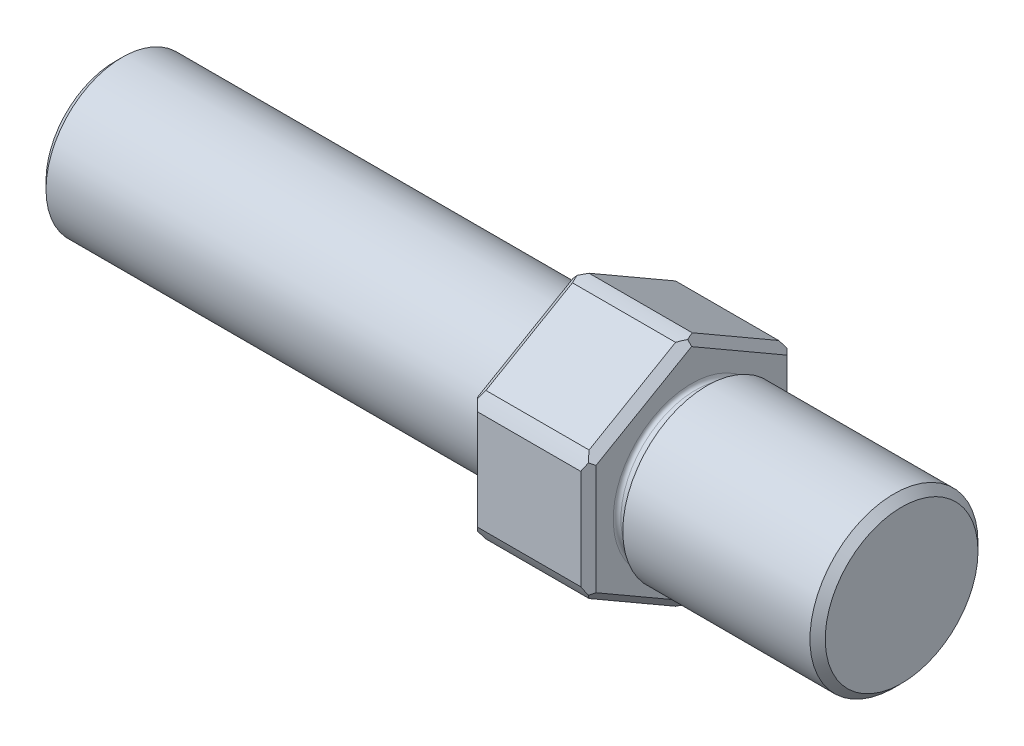
ISO-10303-21;
HEADER;
FILE_DESCRIPTION(('STEP AP214'),'2;1');
FILE_NAME('part.step','',(''),(''),'','','');
FILE_SCHEMA(('AUTOMOTIVE_DESIGN { 1 0 10303 214 1 1 1 1 }'));
ENDSEC;
DATA;
#1=APPLICATION_CONTEXT('core data for automotive mechanical design processes');
#2=APPLICATION_PROTOCOL_DEFINITION('international standard','automotive_design',2000,#1);
#3=PRODUCT_CONTEXT('',#1,'mechanical');
#4=PRODUCT('Part','Part','',(#3));
#5=PRODUCT_RELATED_PRODUCT_CATEGORY('part','',(#4));
#6=PRODUCT_DEFINITION_FORMATION('','',#4);
#7=PRODUCT_DEFINITION_CONTEXT('part definition',#1,'design');
#8=PRODUCT_DEFINITION('design','',#6,#7);
#9=PRODUCT_DEFINITION_SHAPE('','',#8);
#10=(LENGTH_UNIT() NAMED_UNIT(*) SI_UNIT(.MILLI.,.METRE.));
#11=(NAMED_UNIT(*) PLANE_ANGLE_UNIT() SI_UNIT($,.RADIAN.));
#12=(NAMED_UNIT(*) SI_UNIT($,.STERADIAN.) SOLID_ANGLE_UNIT());
#13=UNCERTAINTY_MEASURE_WITH_UNIT(LENGTH_MEASURE(1.E-05),#10,'distance_accuracy_value','');
#14=(GEOMETRIC_REPRESENTATION_CONTEXT(3) GLOBAL_UNCERTAINTY_ASSIGNED_CONTEXT((#13)) GLOBAL_UNIT_ASSIGNED_CONTEXT((#10,
#11,#12)) REPRESENTATION_CONTEXT('',''));
#15=CARTESIAN_POINT('',(0.,0.,0.));
#16=DIRECTION('',(0.,0.,1.));
#17=DIRECTION('',(1.,0.,0.));
#18=AXIS2_PLACEMENT_3D('',#15,#16,#17);
#19=CARTESIAN_POINT('',(-38.5,15.5884572681199,0.));
#20=DIRECTION('',(0.,-0.866025403784439,-0.5));
#21=DIRECTION('',(0.,0.5,-0.866025403784439));
#22=AXIS2_PLACEMENT_3D('',#19,#20,#21);
#23=PLANE('',#22);
#24=DIRECTION('',(-1.,0.,0.));
#25=VECTOR('',#24,1.);
#26=CARTESIAN_POINT('',(17.2226126327971,8.42216874343441,12.4123758264531));
#27=LINE('',#26,#25);
#28=CARTESIAN_POINT('',(-39.5,8.42216874343441,12.4123758264531));
#29=VERTEX_POINT('',#28);
#30=CARTESIAN_POINT('',(-53.,8.4221687434344,12.4123758264531));
#31=VERTEX_POINT('',#30);
#32=EDGE_CURVE('E319',#29,#31,#27,.T.);
#33=ORIENTED_EDGE('',*,*,#32,.F.);
#34=DIRECTION('',(0.,0.5,-0.866025403784439));
#35=VECTOR('',#34,1.);
#36=CARTESIAN_POINT('',(-39.5,15.5884572681199,0.));
#37=LINE('',#36,#35);
#38=CARTESIAN_POINT('',(-39.5,14.9605171587454,1.08762417354695));
#39=VERTEX_POINT('',#38);
#40=EDGE_CURVE('E211',#29,#39,#37,.T.);
#41=ORIENTED_EDGE('',*,*,#40,.T.);
#42=DIRECTION('',(-1.,0.,0.));
#43=VECTOR('',#42,1.);
#44=CARTESIAN_POINT('',(17.2226126327971,14.9605171587454,1.08762417354695));
#45=LINE('',#44,#43);
#46=CARTESIAN_POINT('',(-53.,14.9605171587454,1.08762417354694));
#47=VERTEX_POINT('',#46);
#48=EDGE_CURVE('E197',#47,#39,#45,.F.);
#49=ORIENTED_EDGE('',*,*,#48,.F.);
#50=DIRECTION('',(0.,-0.5,0.866025403784439));
#51=VECTOR('',#50,1.);
#52=CARTESIAN_POINT('',(-53.,15.5884572681199,0.));
#53=LINE('',#52,#51);
#54=EDGE_CURVE('E209',#47,#31,#53,.T.);
#55=ORIENTED_EDGE('',*,*,#54,.T.);
#56=EDGE_LOOP('',(#33,#41,#49,#55));
#57=FACE_BOUND('',#56,.T.);
#58=ADVANCED_FACE('F35',(#57),#23,.F.);
#59=CARTESIAN_POINT('',(-38.5,7.79422863405995,13.5));
#60=DIRECTION('',(0.,0.,-1.));
#61=DIRECTION('',(0.,1.,0.));
#62=AXIS2_PLACEMENT_3D('',#59,#60,#61);
#63=PLANE('',#62);
#64=DIRECTION('',(-1.,0.,0.));
#65=VECTOR('',#64,1.);
#66=CARTESIAN_POINT('',(17.2226126327971,-6.53834841531103,13.5));
#67=LINE('',#66,#65);
#68=CARTESIAN_POINT('',(-39.5,-6.53834841531103,13.5));
#69=VERTEX_POINT('',#68);
#70=CARTESIAN_POINT('',(-53.,-6.53834841531103,13.5));
#71=VERTEX_POINT('',#70);
#72=EDGE_CURVE('E368',#69,#71,#67,.T.);
#73=ORIENTED_EDGE('',*,*,#72,.F.);
#74=DIRECTION('',(0.,1.,0.));
#75=VECTOR('',#74,1.);
#76=CARTESIAN_POINT('',(-39.5,7.79422863405995,13.5));
#77=LINE('',#76,#75);
#78=CARTESIAN_POINT('',(-39.5,6.53834841531103,13.5));
#79=VERTEX_POINT('',#78);
#80=EDGE_CURVE('E430',#69,#79,#77,.T.);
#81=ORIENTED_EDGE('',*,*,#80,.T.);
#82=DIRECTION('',(-1.,0.,0.));
#83=VECTOR('',#82,1.);
#84=CARTESIAN_POINT('',(17.2226126327971,6.53834841531103,13.5));
#85=LINE('',#84,#83);
#86=CARTESIAN_POINT('',(-53.,6.53834841531104,13.5));
#87=VERTEX_POINT('',#86);
#88=EDGE_CURVE('E315',#87,#79,#85,.F.);
#89=ORIENTED_EDGE('',*,*,#88,.F.);
#90=DIRECTION('',(0.,-1.,0.));
#91=VECTOR('',#90,1.);
#92=CARTESIAN_POINT('',(-53.,7.79422863405995,13.5));
#93=LINE('',#92,#91);
#94=EDGE_CURVE('E312',#87,#71,#93,.T.);
#95=ORIENTED_EDGE('',*,*,#94,.T.);
#96=EDGE_LOOP('',(#73,#81,#89,#95));
#97=FACE_BOUND('',#96,.T.);
#98=ADVANCED_FACE('F454',(#97),#63,.F.);
#99=CARTESIAN_POINT('',(-38.5,-7.79422863405995,13.5));
#100=DIRECTION('',(0.,0.866025403784439,-0.5));
#101=DIRECTION('',(0.,0.5,0.866025403784439));
#102=AXIS2_PLACEMENT_3D('',#99,#100,#101);
#103=PLANE('',#102);
#104=DIRECTION('',(-1.,0.,0.));
#105=VECTOR('',#104,1.);
#106=CARTESIAN_POINT('',(17.2226126327971,-14.9605171587454,1.08762417354695));
#107=LINE('',#106,#105);
#108=CARTESIAN_POINT('',(-39.5,-14.9605171587454,1.08762417354695));
#109=VERTEX_POINT('',#108);
#110=CARTESIAN_POINT('',(-53.,-14.9605171587454,1.08762417354694));
#111=VERTEX_POINT('',#110);
#112=EDGE_CURVE('E58',#109,#111,#107,.T.);
#113=ORIENTED_EDGE('',*,*,#112,.F.);
#114=DIRECTION('',(0.,0.5,0.866025403784439));
#115=VECTOR('',#114,1.);
#116=CARTESIAN_POINT('',(-39.5,-7.79422863405995,13.5));
#117=LINE('',#116,#115);
#118=CARTESIAN_POINT('',(-39.5,-8.42216874343441,12.4123758264531));
#119=VERTEX_POINT('',#118);
#120=EDGE_CURVE('E436',#109,#119,#117,.T.);
#121=ORIENTED_EDGE('',*,*,#120,.T.);
#122=DIRECTION('',(-1.,0.,0.));
#123=VECTOR('',#122,1.);
#124=CARTESIAN_POINT('',(17.2226126327971,-8.42216874343441,12.4123758264531));
#125=LINE('',#124,#123);
#126=CARTESIAN_POINT('',(-53.,-8.4221687434344,12.4123758264531));
#127=VERTEX_POINT('',#126);
#128=EDGE_CURVE('E326',#127,#119,#125,.F.);
#129=ORIENTED_EDGE('',*,*,#128,.F.);
#130=DIRECTION('',(0.,-0.5,-0.866025403784439));
#131=VECTOR('',#130,1.);
#132=CARTESIAN_POINT('',(-53.,-7.79422863405995,13.5));
#133=LINE('',#132,#131);
#134=EDGE_CURVE('E433',#127,#111,#133,.T.);
#135=ORIENTED_EDGE('',*,*,#134,.T.);
#136=EDGE_LOOP('',(#113,#121,#129,#135));
#137=FACE_BOUND('',#136,.T.);
#138=ADVANCED_FACE('F474',(#137),#103,.F.);
#139=CARTESIAN_POINT('',(-38.5,-15.5884572681199,0.));
#140=DIRECTION('',(0.,0.866025403784439,0.5));
#141=DIRECTION('',(0.,-0.5,0.866025403784439));
#142=AXIS2_PLACEMENT_3D('',#139,#140,#141);
#143=PLANE('',#142);
#144=DIRECTION('',(-1.,0.,0.));
#145=VECTOR('',#144,1.);
#146=CARTESIAN_POINT('',(17.2226126327971,-8.42216874343444,-12.412375826453));
#147=LINE('',#146,#145);
#148=CARTESIAN_POINT('',(-39.5,-8.42216874343444,-12.412375826453));
#149=VERTEX_POINT('',#148);
#150=CARTESIAN_POINT('',(-53.,-8.42216874343443,-12.412375826453));
#151=VERTEX_POINT('',#150);
#152=EDGE_CURVE('E383',#149,#151,#147,.T.);
#153=ORIENTED_EDGE('',*,*,#152,.F.);
#154=DIRECTION('',(0.,-0.5,0.866025403784439));
#155=VECTOR('',#154,1.);
#156=CARTESIAN_POINT('',(-39.5,-15.5884572681199,0.));
#157=LINE('',#156,#155);
#158=CARTESIAN_POINT('',(-39.5,-14.9605171587454,-1.08762417354695));
#159=VERTEX_POINT('',#158);
#160=EDGE_CURVE('E217',#149,#159,#157,.T.);
#161=ORIENTED_EDGE('',*,*,#160,.T.);
#162=DIRECTION('',(-1.,0.,0.));
#163=VECTOR('',#162,1.);
#164=CARTESIAN_POINT('',(17.2226126327971,-14.9605171587454,-1.08762417354695));
#165=LINE('',#164,#163);
#166=CARTESIAN_POINT('',(-53.,-14.9605171587454,-1.08762417354695));
#167=VERTEX_POINT('',#166);
#168=EDGE_CURVE('E376',#167,#159,#165,.F.);
#169=ORIENTED_EDGE('',*,*,#168,.F.);
#170=DIRECTION('',(0.,0.5,-0.866025403784439));
#171=VECTOR('',#170,1.);
#172=CARTESIAN_POINT('',(-53.,-15.5884572681199,0.));
#173=LINE('',#172,#171);
#174=EDGE_CURVE('E222',#167,#151,#173,.T.);
#175=ORIENTED_EDGE('',*,*,#174,.T.);
#176=EDGE_LOOP('',(#153,#161,#169,#175));
#177=FACE_BOUND('',#176,.T.);
#178=ADVANCED_FACE('F441',(#177),#143,.F.);
#179=CARTESIAN_POINT('',(-38.5,-7.79422863405995,-13.5));
#180=DIRECTION('',(0.,0.,1.));
#181=DIRECTION('',(1.,0.,0.));
#182=AXIS2_PLACEMENT_3D('',#179,#180,#181);
#183=PLANE('',#182);
#184=DIRECTION('',(-1.,0.,0.));
#185=VECTOR('',#184,1.);
#186=CARTESIAN_POINT('',(17.2226126327971,6.53834841531098,-13.5));
#187=LINE('',#186,#185);
#188=CARTESIAN_POINT('',(-39.5,6.53834841531098,-13.5));
#189=VERTEX_POINT('',#188);
#190=CARTESIAN_POINT('',(-53.,6.53834841531096,-13.5));
#191=VERTEX_POINT('',#190);
#192=EDGE_CURVE('E753',#189,#191,#187,.T.);
#193=ORIENTED_EDGE('',*,*,#192,.F.);
#194=DIRECTION('',(0.,-1.,0.));
#195=VECTOR('',#194,1.);
#196=CARTESIAN_POINT('',(-39.5,-7.79422863405995,-13.5));
#197=LINE('',#196,#195);
#198=CARTESIAN_POINT('',(-39.5,-6.53834841531098,-13.5));
#199=VERTEX_POINT('',#198);
#200=EDGE_CURVE('E234',#189,#199,#197,.T.);
#201=ORIENTED_EDGE('',*,*,#200,.T.);
#202=DIRECTION('',(-1.,0.,0.));
#203=VECTOR('',#202,1.);
#204=CARTESIAN_POINT('',(17.2226126327971,-6.53834841531098,-13.5));
#205=LINE('',#204,#203);
#206=CARTESIAN_POINT('',(-53.,-6.53834841531096,-13.5));
#207=VERTEX_POINT('',#206);
#208=EDGE_CURVE('E381',#207,#199,#205,.F.);
#209=ORIENTED_EDGE('',*,*,#208,.F.);
#210=DIRECTION('',(0.,1.,0.));
#211=VECTOR('',#210,1.);
#212=CARTESIAN_POINT('',(-53.,-7.79422863405995,-13.5));
#213=LINE('',#212,#211);
#214=EDGE_CURVE('E231',#207,#191,#213,.T.);
#215=ORIENTED_EDGE('',*,*,#214,.T.);
#216=EDGE_LOOP('',(#193,#201,#209,#215));
#217=FACE_BOUND('',#216,.T.);
#218=ADVANCED_FACE('F570',(#217),#183,.F.);
#219=CARTESIAN_POINT('',(-38.5,7.79422863405995,-13.5));
#220=DIRECTION('',(0.,-0.866025403784439,0.5));
#221=DIRECTION('',(0.,-0.5,-0.866025403784439));
#222=AXIS2_PLACEMENT_3D('',#219,#220,#221);
#223=PLANE('',#222);
#224=DIRECTION('',(-1.,0.,0.));
#225=VECTOR('',#224,1.);
#226=CARTESIAN_POINT('',(17.2226126327971,14.9605171587454,-1.08762417354696));
#227=LINE('',#226,#225);
#228=CARTESIAN_POINT('',(-39.5,14.9605171587454,-1.08762417354696));
#229=VERTEX_POINT('',#228);
#230=CARTESIAN_POINT('',(-53.,14.9605171587454,-1.08762417354696));
#231=VERTEX_POINT('',#230);
#232=EDGE_CURVE('E213',#229,#231,#227,.T.);
#233=ORIENTED_EDGE('',*,*,#232,.F.);
#234=DIRECTION('',(0.,-0.5,-0.866025403784439));
#235=VECTOR('',#234,1.);
#236=CARTESIAN_POINT('',(-39.5,7.79422863405995,-13.5));
#237=LINE('',#236,#235);
#238=CARTESIAN_POINT('',(-39.5,8.42216874343444,-12.412375826453));
#239=VERTEX_POINT('',#238);
#240=EDGE_CURVE('E228',#229,#239,#237,.T.);
#241=ORIENTED_EDGE('',*,*,#240,.T.);
#242=DIRECTION('',(-1.,0.,0.));
#243=VECTOR('',#242,1.);
#244=CARTESIAN_POINT('',(17.2226126327971,8.42216874343444,-12.412375826453));
#245=LINE('',#244,#243);
#246=CARTESIAN_POINT('',(-53.,8.42216874343445,-12.412375826453));
#247=VERTEX_POINT('',#246);
#248=EDGE_CURVE('E349',#247,#239,#245,.F.);
#249=ORIENTED_EDGE('',*,*,#248,.F.);
#250=DIRECTION('',(0.,0.5,0.866025403784439));
#251=VECTOR('',#250,1.);
#252=CARTESIAN_POINT('',(-53.,7.79422863405995,-13.5));
#253=LINE('',#252,#251);
#254=EDGE_CURVE('E219',#247,#231,#253,.T.);
#255=ORIENTED_EDGE('',*,*,#254,.T.);
#256=EDGE_LOOP('',(#233,#241,#249,#255));
#257=FACE_BOUND('',#256,.T.);
#258=ADVANCED_FACE('F348',(#257),#223,.F.);
#259=CARTESIAN_POINT('',(-38.5,0.,-12.5));
#260=DIRECTION('',(0.707106781186547,0.,-0.707106781186547));
#261=DIRECTION('',(0.,-1.,0.));
#262=AXIS2_PLACEMENT_3D('',#259,#260,#261);
#263=PLANE('',#262);
#264=ORIENTED_EDGE('',*,*,#200,.F.);
#265=CARTESIAN_POINT('',(-26.,0.,0.));
#266=DIRECTION('',(0.707106781186547,0.,-0.707106781186547));
#267=DIRECTION('',(-0.707106781186548,0.,-0.707106781186548));
#268=AXIS2_PLACEMENT_3D('',#265,#266,#267);
#269=ELLIPSE('',#268,21.2132034355964,15.);
#270=CARTESIAN_POINT('',(-38.9903810567666,7.5,-12.9903810567666));
#271=VERTEX_POINT('',#270);
#272=EDGE_CURVE('E444',#189,#271,#269,.T.);
#273=ORIENTED_EDGE('',*,*,#272,.T.);
#274=DIRECTION('',(0.654653670707977,-0.377964473009228,0.654653670707977));
#275=VECTOR('',#274,1.);
#276=CARTESIAN_POINT('',(-36.7142857142857,6.18589574131743,-10.7142857142857));
#277=LINE('',#276,#275);
#278=CARTESIAN_POINT('',(-38.5,7.21687836487033,-12.5));
#279=VERTEX_POINT('',#278);
#280=EDGE_CURVE('E264',#279,#271,#277,.F.);
#281=ORIENTED_EDGE('',*,*,#280,.F.);
#282=DIRECTION('',(0.,1.,0.));
#283=VECTOR('',#282,1.);
#284=CARTESIAN_POINT('',(-38.5,7.79422863405995,-12.5));
#285=LINE('',#284,#283);
#286=CARTESIAN_POINT('',(-38.5,-7.21687836487033,-12.5));
#287=VERTEX_POINT('',#286);
#288=EDGE_CURVE('E414',#287,#279,#285,.T.);
#289=ORIENTED_EDGE('',*,*,#288,.F.);
#290=DIRECTION('',(-0.654653670707978,-0.377964473009226,-0.654653670707978));
#291=VECTOR('',#290,1.);
#292=CARTESIAN_POINT('',(-36.7142857142857,-6.18589574131743,-10.7142857142857));
#293=LINE('',#292,#291);
#294=CARTESIAN_POINT('',(-38.9903810567666,-7.49999999999999,-12.9903810567666));
#295=VERTEX_POINT('',#294);
#296=EDGE_CURVE('E262',#295,#287,#293,.F.);
#297=ORIENTED_EDGE('',*,*,#296,.F.);
#298=EDGE_CURVE('E271',#295,#199,#269,.T.);
#299=ORIENTED_EDGE('',*,*,#298,.T.);
#300=EDGE_LOOP('',(#264,#273,#281,#289,#297,#299));
#301=FACE_BOUND('',#300,.T.);
#302=ADVANCED_FACE('F521',(#301),#263,.T.);
#303=CARTESIAN_POINT('',(-38.5,10.8253175473055,-6.25000000000001));
#304=DIRECTION('',(0.707106781186548,0.612372435695794,-0.353553390593274));
#305=DIRECTION('',(0.,-0.5,-0.866025403784439));
#306=AXIS2_PLACEMENT_3D('',#303,#304,#305);
#307=PLANE('',#306);
#308=ORIENTED_EDGE('',*,*,#240,.F.);
#309=CARTESIAN_POINT('',(-26.,0.,0.));
#310=DIRECTION('',(0.707106781186548,0.612372435695794,-0.353553390593274));
#311=DIRECTION('',(-0.707106781186547,0.612372435695795,-0.353553390593274));
#312=AXIS2_PLACEMENT_3D('',#309,#310,#311);
#313=ELLIPSE('',#312,21.2132034355964,15.);
#314=CARTESIAN_POINT('',(-38.9903810567666,15.,0.));
#315=VERTEX_POINT('',#314);
#316=EDGE_CURVE('E316',#229,#315,#313,.T.);
#317=ORIENTED_EDGE('',*,*,#316,.T.);
#318=DIRECTION('',(0.654653670707977,-0.755928946018454,0.));
#319=VECTOR('',#318,1.);
#320=CARTESIAN_POINT('',(-36.7142857142857,12.3717914826349,0.));
#321=LINE('',#320,#319);
#322=CARTESIAN_POINT('',(-38.5,14.4337567297407,0.));
#323=VERTEX_POINT('',#322);
#324=EDGE_CURVE('E259',#323,#315,#321,.F.);
#325=ORIENTED_EDGE('',*,*,#324,.F.);
#326=DIRECTION('',(0.,0.5,0.866025403784439));
#327=VECTOR('',#326,1.);
#328=CARTESIAN_POINT('',(-38.5,14.7224318643355,0.499999999999994));
#329=LINE('',#328,#327);
#330=EDGE_CURVE('E416',#279,#323,#329,.T.);
#331=ORIENTED_EDGE('',*,*,#330,.F.);
#332=ORIENTED_EDGE('',*,*,#280,.T.);
#333=EDGE_CURVE('E323',#271,#239,#313,.T.);
#334=ORIENTED_EDGE('',*,*,#333,.T.);
#335=EDGE_LOOP('',(#308,#317,#325,#331,#332,#334));
#336=FACE_BOUND('',#335,.T.);
#337=ADVANCED_FACE('F343',(#336),#307,.T.);
#338=CARTESIAN_POINT('',(-38.5,-10.8253175473055,-6.25000000000001));
#339=DIRECTION('',(0.707106781186547,-0.612372435695795,-0.353553390593274));
#340=DIRECTION('',(0.,-0.5,0.866025403784439));
#341=AXIS2_PLACEMENT_3D('',#338,#339,#340);
#342=PLANE('',#341);
#343=ORIENTED_EDGE('',*,*,#160,.F.);
#344=CARTESIAN_POINT('',(-25.9999999999999,0.,0.));
#345=DIRECTION('',(0.707106781186547,-0.612372435695795,-0.353553390593274));
#346=DIRECTION('',(-0.707106781186548,-0.612372435695794,-0.353553390593274));
#347=AXIS2_PLACEMENT_3D('',#344,#345,#346);
#348=ELLIPSE('',#347,21.2132034355964,15.);
#349=EDGE_CURVE('E375',#149,#295,#348,.T.);
#350=ORIENTED_EDGE('',*,*,#349,.T.);
#351=ORIENTED_EDGE('',*,*,#296,.T.);
#352=DIRECTION('',(0.,0.5,-0.866025403784439));
#353=VECTOR('',#352,1.);
#354=CARTESIAN_POINT('',(-38.5,-6.92820323027552,-13.));
#355=LINE('',#354,#353);
#356=CARTESIAN_POINT('',(-38.5,-14.4337567297407,0.));
#357=VERTEX_POINT('',#356);
#358=EDGE_CURVE('E420',#357,#287,#355,.T.);
#359=ORIENTED_EDGE('',*,*,#358,.F.);
#360=DIRECTION('',(-0.654653670707977,-0.755928946018454,0.));
#361=VECTOR('',#360,1.);
#362=CARTESIAN_POINT('',(-36.7142857142857,-12.3717914826348,0.));
#363=LINE('',#362,#361);
#364=CARTESIAN_POINT('',(-38.9903810567666,-15.,0.));
#365=VERTEX_POINT('',#364);
#366=EDGE_CURVE('E257',#365,#357,#363,.F.);
#367=ORIENTED_EDGE('',*,*,#366,.F.);
#368=EDGE_CURVE('E371',#365,#159,#348,.T.);
#369=ORIENTED_EDGE('',*,*,#368,.T.);
#370=EDGE_LOOP('',(#343,#350,#351,#359,#367,#369));
#371=FACE_BOUND('',#370,.T.);
#372=ADVANCED_FACE('F515',(#371),#342,.T.);
#373=CARTESIAN_POINT('',(-38.5,10.8253175473055,6.25000000000001));
#374=DIRECTION('',(0.707106781186547,0.612372435695795,0.353553390593274));
#375=DIRECTION('',(0.,0.5,-0.866025403784439));
#376=AXIS2_PLACEMENT_3D('',#373,#374,#375);
#377=PLANE('',#376);
#378=ORIENTED_EDGE('',*,*,#40,.F.);
#379=CARTESIAN_POINT('',(-26.,0.,0.));
#380=DIRECTION('',(0.707106781186547,0.612372435695795,0.353553390593274));
#381=DIRECTION('',(-0.707106781186548,0.612372435695794,0.353553390593273));
#382=AXIS2_PLACEMENT_3D('',#379,#380,#381);
#383=ELLIPSE('',#382,21.2132034355965,15.);
#384=CARTESIAN_POINT('',(-38.9903810567666,7.50000000000001,12.9903810567666));
#385=VERTEX_POINT('',#384);
#386=EDGE_CURVE('E325',#29,#385,#383,.T.);
#387=ORIENTED_EDGE('',*,*,#386,.T.);
#388=DIRECTION('',(0.654653670707978,-0.377964473009226,-0.654653670707977));
#389=VECTOR('',#388,1.);
#390=CARTESIAN_POINT('',(-36.7142857142857,6.18589574131743,10.7142857142857));
#391=LINE('',#390,#389);
#392=CARTESIAN_POINT('',(-38.5,7.21687836487033,12.5));
#393=VERTEX_POINT('',#392);
#394=EDGE_CURVE('E253',#393,#385,#391,.F.);
#395=ORIENTED_EDGE('',*,*,#394,.F.);
#396=DIRECTION('',(0.,-0.5,0.866025403784439));
#397=VECTOR('',#396,1.);
#398=CARTESIAN_POINT('',(-38.5,6.92820323027552,13.));
#399=LINE('',#398,#397);
#400=EDGE_CURVE('E418',#323,#393,#399,.T.);
#401=ORIENTED_EDGE('',*,*,#400,.F.);
#402=ORIENTED_EDGE('',*,*,#324,.T.);
#403=EDGE_CURVE('E212',#315,#39,#383,.T.);
#404=ORIENTED_EDGE('',*,*,#403,.T.);
#405=EDGE_LOOP('',(#378,#387,#395,#401,#402,#404));
#406=FACE_BOUND('',#405,.T.);
#407=ADVANCED_FACE('F337',(#406),#377,.T.);
#408=CARTESIAN_POINT('',(-38.5,-10.8253175473055,6.25000000000001));
#409=DIRECTION('',(0.707106781186548,-0.612372435695794,0.353553390593274));
#410=DIRECTION('',(0.,0.5,0.866025403784439));
#411=AXIS2_PLACEMENT_3D('',#408,#409,#410);
#412=PLANE('',#411);
#413=ORIENTED_EDGE('',*,*,#120,.F.);
#414=CARTESIAN_POINT('',(-26.,0.,0.));
#415=DIRECTION('',(0.707106781186548,-0.612372435695794,0.353553390593274));
#416=DIRECTION('',(-0.707106781186547,-0.612372435695795,0.353553390593274));
#417=AXIS2_PLACEMENT_3D('',#414,#415,#416);
#418=ELLIPSE('',#417,21.2132034355964,15.);
#419=EDGE_CURVE('E362',#109,#365,#418,.T.);
#420=ORIENTED_EDGE('',*,*,#419,.T.);
#421=ORIENTED_EDGE('',*,*,#366,.T.);
#422=DIRECTION('',(0.,-0.5,-0.866025403784439));
#423=VECTOR('',#422,1.);
#424=CARTESIAN_POINT('',(-38.5,-14.7224318643355,-0.499999999999992));
#425=LINE('',#424,#423);
#426=CARTESIAN_POINT('',(-38.5,-7.21687836487033,12.5));
#427=VERTEX_POINT('',#426);
#428=EDGE_CURVE('E423',#427,#357,#425,.T.);
#429=ORIENTED_EDGE('',*,*,#428,.F.);
#430=DIRECTION('',(-0.654653670707977,-0.377964473009228,0.654653670707977));
#431=VECTOR('',#430,1.);
#432=CARTESIAN_POINT('',(-36.7142857142857,-6.18589574131742,10.7142857142857));
#433=LINE('',#432,#431);
#434=CARTESIAN_POINT('',(-38.9903810567666,-7.5,12.9903810567666));
#435=VERTEX_POINT('',#434);
#436=EDGE_CURVE('E251',#435,#427,#433,.F.);
#437=ORIENTED_EDGE('',*,*,#436,.F.);
#438=EDGE_CURVE('E357',#435,#119,#418,.T.);
#439=ORIENTED_EDGE('',*,*,#438,.T.);
#440=EDGE_LOOP('',(#413,#420,#421,#429,#437,#439));
#441=FACE_BOUND('',#440,.T.);
#442=ADVANCED_FACE('F510',(#441),#412,.T.);
#443=CARTESIAN_POINT('',(-38.5,0.,12.5));
#444=DIRECTION('',(0.707106781186547,0.,0.707106781186548));
#445=DIRECTION('',(0.,1.,0.));
#446=AXIS2_PLACEMENT_3D('',#443,#444,#445);
#447=PLANE('',#446);
#448=ORIENTED_EDGE('',*,*,#80,.F.);
#449=CARTESIAN_POINT('',(-26.,0.,0.));
#450=DIRECTION('',(0.707106781186547,0.,0.707106781186548));
#451=DIRECTION('',(-0.707106781186548,0.,0.707106781186547));
#452=AXIS2_PLACEMENT_3D('',#449,#450,#451);
#453=ELLIPSE('',#452,21.2132034355964,15.);
#454=EDGE_CURVE('E336',#69,#435,#453,.T.);
#455=ORIENTED_EDGE('',*,*,#454,.T.);
#456=ORIENTED_EDGE('',*,*,#436,.T.);
#457=DIRECTION('',(0.,-1.,0.));
#458=VECTOR('',#457,1.);
#459=CARTESIAN_POINT('',(-38.5,-7.79422863405995,12.5));
#460=LINE('',#459,#458);
#461=EDGE_CURVE('E426',#393,#427,#460,.T.);
#462=ORIENTED_EDGE('',*,*,#461,.F.);
#463=ORIENTED_EDGE('',*,*,#394,.T.);
#464=EDGE_CURVE('E330',#385,#79,#453,.T.);
#465=ORIENTED_EDGE('',*,*,#464,.T.);
#466=EDGE_LOOP('',(#448,#455,#456,#462,#463,#465));
#467=FACE_BOUND('',#466,.T.);
#468=ADVANCED_FACE('F456',(#467),#447,.T.);
#469=CARTESIAN_POINT('',(-53.,-15.5884572681199,0.));
#470=DIRECTION('',(0.707106781186543,0.612372435695798,0.353553390593276));
#471=DIRECTION('',(0.,0.5,-0.866025403784439));
#472=AXIS2_PLACEMENT_3D('',#469,#470,#471);
#473=PLANE('',#472);
#474=DIRECTION('',(0.654653670707981,-0.377964473009225,-0.654653670707974));
#475=VECTOR('',#474,1.);
#476=CARTESIAN_POINT('',(-56.8571428571429,-5.5673061671857,-9.64285714285717));
#477=LINE('',#476,#475);
#478=CARTESIAN_POINT('',(-53.5096189432334,-7.49999999999999,-12.9903810567666));
#479=VERTEX_POINT('',#478);
#480=CARTESIAN_POINT('',(-54.,-7.21687836487033,-12.5));
#481=VERTEX_POINT('',#480);
#482=EDGE_CURVE('E254',#479,#481,#477,.F.);
#483=ORIENTED_EDGE('',*,*,#482,.F.);
#484=CARTESIAN_POINT('',(-66.5000000000002,0.,0.));
#485=DIRECTION('',(0.707106781186543,0.612372435695798,0.353553390593276));
#486=DIRECTION('',(-0.707106781186552,0.612372435695791,0.353553390593272));
#487=AXIS2_PLACEMENT_3D('',#484,#485,#486);
#488=ELLIPSE('',#487,21.2132034355965,15.);
#489=EDGE_CURVE('E50',#479,#151,#488,.F.);
#490=ORIENTED_EDGE('',*,*,#489,.T.);
#491=ORIENTED_EDGE('',*,*,#174,.F.);
#492=CARTESIAN_POINT('',(-53.5096189432334,-15.,0.));
#493=VERTEX_POINT('',#492);
#494=EDGE_CURVE('E297',#167,#493,#488,.F.);
#495=ORIENTED_EDGE('',*,*,#494,.T.);
#496=DIRECTION('',(-0.654653670707981,0.755928946018451,0.));
#497=VECTOR('',#496,1.);
#498=CARTESIAN_POINT('',(-53.,-15.5884572681199,0.));
#499=LINE('',#498,#497);
#500=CARTESIAN_POINT('',(-54.,-14.4337567297407,0.));
#501=VERTEX_POINT('',#500);
#502=EDGE_CURVE('E278',#501,#493,#499,.F.);
#503=ORIENTED_EDGE('',*,*,#502,.F.);
#504=DIRECTION('',(0.,-0.5,0.866025403784439));
#505=VECTOR('',#504,1.);
#506=CARTESIAN_POINT('',(-54.,-10.8253175473055,-6.25000000000001));
#507=LINE('',#506,#505);
#508=EDGE_CURVE('E237',#481,#501,#507,.T.);
#509=ORIENTED_EDGE('',*,*,#508,.F.);
#510=EDGE_LOOP('',(#483,#490,#491,#495,#503,#509));
#511=FACE_BOUND('',#510,.T.);
#512=ADVANCED_FACE('F37',(#511),#473,.F.);
#513=CARTESIAN_POINT('',(-53.,-7.79422863405995,-13.5));
#514=DIRECTION('',(0.707106781186544,0.,0.707106781186551));
#515=DIRECTION('',(0.,1.,0.));
#516=AXIS2_PLACEMENT_3D('',#513,#514,#515);
#517=PLANE('',#516);
#518=DIRECTION('',(0.654653670707981,0.377964473009226,-0.654653670707974));
#519=VECTOR('',#518,1.);
#520=CARTESIAN_POINT('',(-56.8571428571429,5.56730616718569,-9.64285714285717));
#521=LINE('',#520,#519);
#522=CARTESIAN_POINT('',(-53.5096189432334,7.49999999999999,-12.9903810567666));
#523=VERTEX_POINT('',#522);
#524=CARTESIAN_POINT('',(-54.,7.21687836487033,-12.5));
#525=VERTEX_POINT('',#524);
#526=EDGE_CURVE('E276',#523,#525,#521,.F.);
#527=ORIENTED_EDGE('',*,*,#526,.F.);
#528=CARTESIAN_POINT('',(-66.5000000000002,0.,0.));
#529=DIRECTION('',(0.707106781186544,0.,0.707106781186551));
#530=DIRECTION('',(-0.707106781186551,0.,0.707106781186544));
#531=AXIS2_PLACEMENT_3D('',#528,#529,#530);
#532=ELLIPSE('',#531,21.2132034355965,15.);
#533=EDGE_CURVE('E356',#523,#191,#532,.F.);
#534=ORIENTED_EDGE('',*,*,#533,.T.);
#535=ORIENTED_EDGE('',*,*,#214,.F.);
#536=EDGE_CURVE('E286',#207,#479,#532,.F.);
#537=ORIENTED_EDGE('',*,*,#536,.T.);
#538=ORIENTED_EDGE('',*,*,#482,.T.);
#539=DIRECTION('',(0.,-1.,0.));
#540=VECTOR('',#539,1.);
#541=CARTESIAN_POINT('',(-54.,0.,-12.5));
#542=LINE('',#541,#540);
#543=EDGE_CURVE('E239',#525,#481,#542,.T.);
#544=ORIENTED_EDGE('',*,*,#543,.F.);
#545=EDGE_LOOP('',(#527,#534,#535,#537,#538,#544));
#546=FACE_BOUND('',#545,.T.);
#547=ADVANCED_FACE('F284',(#546),#517,.F.);
#548=CARTESIAN_POINT('',(-53.,-7.79422863405995,13.5));
#549=DIRECTION('',(0.707106781186543,0.612372435695798,-0.353553390593276));
#550=DIRECTION('',(0.,-0.5,-0.866025403784439));
#551=AXIS2_PLACEMENT_3D('',#548,#549,#550);
#552=PLANE('',#551);
#553=ORIENTED_EDGE('',*,*,#502,.T.);
#554=CARTESIAN_POINT('',(-66.5000000000001,0.,0.));
#555=DIRECTION('',(0.707106781186543,0.612372435695798,-0.353553390593276));
#556=DIRECTION('',(-0.707106781186552,0.612372435695791,-0.353553390593272));
#557=AXIS2_PLACEMENT_3D('',#554,#555,#556);
#558=ELLIPSE('',#557,21.2132034355965,15.);
#559=EDGE_CURVE('E328',#493,#111,#558,.F.);
#560=ORIENTED_EDGE('',*,*,#559,.T.);
#561=ORIENTED_EDGE('',*,*,#134,.F.);
#562=CARTESIAN_POINT('',(-53.5096189432334,-7.50000000000001,12.9903810567666));
#563=VERTEX_POINT('',#562);
#564=EDGE_CURVE('E324',#127,#563,#558,.F.);
#565=ORIENTED_EDGE('',*,*,#564,.T.);
#566=DIRECTION('',(-0.654653670707981,0.377964473009225,-0.654653670707974));
#567=VECTOR('',#566,1.);
#568=CARTESIAN_POINT('',(-53.,-7.79422863405995,13.5));
#569=LINE('',#568,#567);
#570=CARTESIAN_POINT('',(-54.,-7.21687836487033,12.5));
#571=VERTEX_POINT('',#570);
#572=EDGE_CURVE('E273',#571,#563,#569,.F.);
#573=ORIENTED_EDGE('',*,*,#572,.F.);
#574=DIRECTION('',(0.,0.5,0.866025403784439));
#575=VECTOR('',#574,1.);
#576=CARTESIAN_POINT('',(-54.,-10.8253175473055,6.25000000000001));
#577=LINE('',#576,#575);
#578=EDGE_CURVE('E242',#501,#571,#577,.T.);
#579=ORIENTED_EDGE('',*,*,#578,.F.);
#580=EDGE_LOOP('',(#553,#560,#561,#565,#573,#579));
#581=FACE_BOUND('',#580,.T.);
#582=ADVANCED_FACE('F300',(#581),#552,.F.);
#583=CARTESIAN_POINT('',(-53.,7.79422863405995,-13.5));
#584=DIRECTION('',(0.707106781186544,-0.612372435695797,0.353553390593275));
#585=DIRECTION('',(0.,0.5,0.866025403784439));
#586=AXIS2_PLACEMENT_3D('',#583,#584,#585);
#587=PLANE('',#586);
#588=DIRECTION('',(0.654653670707981,0.755928946018451,0.));
#589=VECTOR('',#588,1.);
#590=CARTESIAN_POINT('',(-56.8571428571429,11.1346123343714,0.));
#591=LINE('',#590,#589);
#592=CARTESIAN_POINT('',(-53.5096189432334,15.,0.));
#593=VERTEX_POINT('',#592);
#594=CARTESIAN_POINT('',(-54.,14.4337567297407,0.));
#595=VERTEX_POINT('',#594);
#596=EDGE_CURVE('E270',#593,#595,#591,.F.);
#597=ORIENTED_EDGE('',*,*,#596,.F.);
#598=CARTESIAN_POINT('',(-66.5000000000001,0.,0.));
#599=DIRECTION('',(0.707106781186544,-0.612372435695797,0.353553390593275));
#600=DIRECTION('',(-0.707106781186551,-0.612372435695792,0.353553390593272));
#601=AXIS2_PLACEMENT_3D('',#598,#599,#600);
#602=ELLIPSE('',#601,21.2132034355965,15.);
#603=EDGE_CURVE('E200',#593,#231,#602,.F.);
#604=ORIENTED_EDGE('',*,*,#603,.T.);
#605=ORIENTED_EDGE('',*,*,#254,.F.);
#606=EDGE_CURVE('E353',#247,#523,#602,.F.);
#607=ORIENTED_EDGE('',*,*,#606,.T.);
#608=ORIENTED_EDGE('',*,*,#526,.T.);
#609=DIRECTION('',(0.,-0.5,-0.866025403784439));
#610=VECTOR('',#609,1.);
#611=CARTESIAN_POINT('',(-54.,10.8253175473055,-6.25000000000001));
#612=LINE('',#611,#610);
#613=EDGE_CURVE('E246',#595,#525,#612,.T.);
#614=ORIENTED_EDGE('',*,*,#613,.F.);
#615=EDGE_LOOP('',(#597,#604,#605,#607,#608,#614));
#616=FACE_BOUND('',#615,.T.);
#617=ADVANCED_FACE('F530',(#616),#587,.F.);
#618=CARTESIAN_POINT('',(-53.,7.79422863405995,13.5));
#619=DIRECTION('',(0.707106781186543,0.,-0.707106781186551));
#620=DIRECTION('',(0.,-1.,0.));
#621=AXIS2_PLACEMENT_3D('',#618,#619,#620);
#622=PLANE('',#621);
#623=ORIENTED_EDGE('',*,*,#572,.T.);
#624=CARTESIAN_POINT('',(-66.5000000000001,0.,0.));
#625=DIRECTION('',(0.707106781186543,0.,-0.707106781186551));
#626=DIRECTION('',(-0.707106781186552,0.,-0.707106781186544));
#627=AXIS2_PLACEMENT_3D('',#624,#625,#626);
#628=ELLIPSE('',#627,21.2132034355965,15.);
#629=EDGE_CURVE('E318',#563,#71,#628,.F.);
#630=ORIENTED_EDGE('',*,*,#629,.T.);
#631=ORIENTED_EDGE('',*,*,#94,.F.);
#632=CARTESIAN_POINT('',(-53.5096189432334,7.50000000000001,12.9903810567666));
#633=VERTEX_POINT('',#632);
#634=EDGE_CURVE('E309',#87,#633,#628,.F.);
#635=ORIENTED_EDGE('',*,*,#634,.T.);
#636=DIRECTION('',(-0.654653670707981,-0.377964473009226,-0.654653670707974));
#637=VECTOR('',#636,1.);
#638=CARTESIAN_POINT('',(-53.,7.79422863405995,13.5));
#639=LINE('',#638,#637);
#640=CARTESIAN_POINT('',(-54.,7.21687836487033,12.5));
#641=VERTEX_POINT('',#640);
#642=EDGE_CURVE('E268',#641,#633,#639,.F.);
#643=ORIENTED_EDGE('',*,*,#642,.F.);
#644=DIRECTION('',(0.,1.,0.));
#645=VECTOR('',#644,1.);
#646=CARTESIAN_POINT('',(-54.,0.,12.5));
#647=LINE('',#646,#645);
#648=EDGE_CURVE('E244',#571,#641,#647,.T.);
#649=ORIENTED_EDGE('',*,*,#648,.F.);
#650=EDGE_LOOP('',(#623,#630,#631,#635,#643,#649));
#651=FACE_BOUND('',#650,.T.);
#652=ADVANCED_FACE('F307',(#651),#622,.F.);
#653=CARTESIAN_POINT('',(-53.,15.5884572681199,0.));
#654=DIRECTION('',(0.707106781186544,-0.612372435695798,-0.353553390593276));
#655=DIRECTION('',(0.,-0.5,0.866025403784439));
#656=AXIS2_PLACEMENT_3D('',#653,#654,#655);
#657=PLANE('',#656);
#658=ORIENTED_EDGE('',*,*,#642,.T.);
#659=CARTESIAN_POINT('',(-66.5000000000001,0.,0.));
#660=DIRECTION('',(0.707106781186544,-0.612372435695798,-0.353553390593276));
#661=DIRECTION('',(-0.707106781186551,-0.612372435695791,-0.353553390593272));
#662=AXIS2_PLACEMENT_3D('',#659,#660,#661);
#663=ELLIPSE('',#662,21.2132034355965,15.);
#664=EDGE_CURVE('E11',#633,#31,#663,.F.);
#665=ORIENTED_EDGE('',*,*,#664,.T.);
#666=ORIENTED_EDGE('',*,*,#54,.F.);
#667=EDGE_CURVE('E39',#47,#593,#663,.F.);
#668=ORIENTED_EDGE('',*,*,#667,.T.);
#669=ORIENTED_EDGE('',*,*,#596,.T.);
#670=DIRECTION('',(0.,0.5,-0.866025403784439));
#671=VECTOR('',#670,1.);
#672=CARTESIAN_POINT('',(-54.,10.8253175473055,6.25000000000001));
#673=LINE('',#672,#671);
#674=EDGE_CURVE('E204',#641,#595,#673,.T.);
#675=ORIENTED_EDGE('',*,*,#674,.F.);
#676=EDGE_LOOP('',(#658,#665,#666,#668,#669,#675));
#677=FACE_BOUND('',#676,.T.);
#678=ADVANCED_FACE('F216',(#677),#657,.F.);
#679=CARTESIAN_POINT('',(-38.5,0.,0.));
#680=DIRECTION('',(1.,0.,0.));
#681=DIRECTION('',(0.,0.,-1.));
#682=AXIS2_PLACEMENT_3D('',#679,#680,#681);
#683=PLANE('',#682);
#684=ORIENTED_EDGE('',*,*,#400,.T.);
#685=ORIENTED_EDGE('',*,*,#461,.T.);
#686=ORIENTED_EDGE('',*,*,#428,.T.);
#687=ORIENTED_EDGE('',*,*,#358,.T.);
#688=ORIENTED_EDGE('',*,*,#288,.T.);
#689=ORIENTED_EDGE('',*,*,#330,.T.);
#690=EDGE_LOOP('',(#684,#685,#686,#687,#688,#689));
#691=FACE_BOUND('',#690,.T.);
#692=CARTESIAN_POINT('',(-38.5,0.,0.));
#693=DIRECTION('',(1.,0.,0.));
#694=DIRECTION('',(0.,0.,-1.));
#695=AXIS2_PLACEMENT_3D('',#692,#693,#694);
#696=CIRCLE('',#695,10.25);
#697=CARTESIAN_POINT('',(-38.5,0.,-10.25));
#698=VERTEX_POINT('',#697);
#699=EDGE_CURVE('E405',#698,#698,#696,.F.);
#700=ORIENTED_EDGE('',*,*,#699,.T.);
#701=EDGE_LOOP('',(#700));
#702=FACE_BOUND('',#701,.T.);
#703=ADVANCED_FACE('F527',(#691,#702),#683,.T.);
#704=CARTESIAN_POINT('',(-54.,0.,0.));
#705=DIRECTION('',(1.,0.,0.));
#706=DIRECTION('',(0.,0.,-1.));
#707=AXIS2_PLACEMENT_3D('',#704,#705,#706);
#708=PLANE('',#707);
#709=ORIENTED_EDGE('',*,*,#648,.T.);
#710=ORIENTED_EDGE('',*,*,#674,.T.);
#711=ORIENTED_EDGE('',*,*,#613,.T.);
#712=ORIENTED_EDGE('',*,*,#543,.T.);
#713=ORIENTED_EDGE('',*,*,#508,.T.);
#714=ORIENTED_EDGE('',*,*,#578,.T.);
#715=EDGE_LOOP('',(#709,#710,#711,#712,#713,#714));
#716=FACE_BOUND('',#715,.T.);
#717=CARTESIAN_POINT('',(-54.,0.,0.));
#718=DIRECTION('',(1.,0.,0.));
#719=DIRECTION('',(0.,0.,-1.));
#720=AXIS2_PLACEMENT_3D('',#717,#718,#719);
#721=CIRCLE('',#720,11.);
#722=CARTESIAN_POINT('',(-54.,0.,-11.));
#723=VERTEX_POINT('',#722);
#724=EDGE_CURVE('E388',#723,#723,#721,.T.);
#725=ORIENTED_EDGE('',*,*,#724,.T.);
#726=EDGE_LOOP('',(#725));
#727=FACE_BOUND('',#726,.T.);
#728=ADVANCED_FACE('F290',(#716,#727),#708,.F.);
#729=CARTESIAN_POINT('',(0.,0.,0.));
#730=DIRECTION('',(1.,0.,0.));
#731=DIRECTION('',(0.,0.,-1.));
#732=AXIS2_PLACEMENT_3D('',#729,#730,#731);
#733=CYLINDRICAL_SURFACE('',#732,10.);
#734=CARTESIAN_POINT('',(-113.,0.,0.));
#735=DIRECTION('',(-1.,0.,0.));
#736=DIRECTION('',(0.,0.,1.));
#737=AXIS2_PLACEMENT_3D('',#734,#735,#736);
#738=CIRCLE('',#737,10.);
#739=CARTESIAN_POINT('',(-113.,0.,10.));
#740=VERTEX_POINT('',#739);
#741=EDGE_CURVE('E411',#740,#740,#738,.F.);
#742=ORIENTED_EDGE('',*,*,#741,.T.);
#743=EDGE_LOOP('',(#742));
#744=FACE_BOUND('',#743,.T.);
#745=CARTESIAN_POINT('',(-55.,0.,0.));
#746=DIRECTION('',(-1.,0.,0.));
#747=DIRECTION('',(0.,0.,1.));
#748=AXIS2_PLACEMENT_3D('',#745,#746,#747);
#749=CIRCLE('',#748,10.);
#750=CARTESIAN_POINT('',(-55.,0.,10.));
#751=VERTEX_POINT('',#750);
#752=EDGE_CURVE('E391',#751,#751,#749,.T.);
#753=ORIENTED_EDGE('',*,*,#752,.T.);
#754=EDGE_LOOP('',(#753));
#755=FACE_BOUND('',#754,.T.);
#756=ADVANCED_FACE('F484',(#744,#755),#733,.T.);
#757=CARTESIAN_POINT('',(-55.,0.,0.));
#758=DIRECTION('',(-1.,0.,0.));
#759=DIRECTION('',(0.,0.,1.));
#760=AXIS2_PLACEMENT_3D('',#757,#758,#759);
#761=TOROIDAL_SURFACE('',#760,11.,1.);
#762=ORIENTED_EDGE('',*,*,#752,.F.);
#763=EDGE_LOOP('',(#762));
#764=FACE_BOUND('',#763,.T.);
#765=ORIENTED_EDGE('',*,*,#724,.F.);
#766=EDGE_LOOP('',(#765));
#767=FACE_BOUND('',#766,.T.);
#768=ADVANCED_FACE('F487',(#764,#767),#761,.F.);
#769=CARTESIAN_POINT('',(-36.5,0.,11.75));
#770=DIRECTION('',(-1.,0.,0.));
#771=DIRECTION('',(0.,0.,1.));
#772=AXIS2_PLACEMENT_3D('',#769,#770,#771);
#773=PLANE('',#772);
#774=CARTESIAN_POINT('',(-36.5,0.,0.));
#775=DIRECTION('',(-1.,0.,0.));
#776=DIRECTION('',(0.,0.,1.));
#777=AXIS2_PLACEMENT_3D('',#774,#775,#776);
#778=CIRCLE('',#777,11.);
#779=CARTESIAN_POINT('',(-36.5,0.,11.));
#780=VERTEX_POINT('',#779);
#781=EDGE_CURVE('E387',#780,#780,#778,.F.);
#782=ORIENTED_EDGE('',*,*,#781,.F.);
#783=EDGE_LOOP('',(#782));
#784=FACE_BOUND('',#783,.T.);
#785=CARTESIAN_POINT('',(-36.5,0.,0.));
#786=DIRECTION('',(1.,0.,0.));
#787=DIRECTION('',(0.,0.,-1.));
#788=AXIS2_PLACEMENT_3D('',#785,#786,#787);
#789=CIRCLE('',#788,9.75000000000001);
#790=CARTESIAN_POINT('',(-36.5,0.,-9.75000000000001));
#791=VERTEX_POINT('',#790);
#792=EDGE_CURVE('E267',#791,#791,#789,.T.);
#793=ORIENTED_EDGE('',*,*,#792,.T.);
#794=EDGE_LOOP('',(#793));
#795=FACE_BOUND('',#794,.T.);
#796=ADVANCED_FACE('F496',(#784,#795),#773,.T.);
#797=CARTESIAN_POINT('',(0.,0.,0.));
#798=DIRECTION('',(1.,0.,0.));
#799=DIRECTION('',(0.,0.,-1.));
#800=AXIS2_PLACEMENT_3D('',#797,#798,#799);
#801=CYLINDRICAL_SURFACE('',#800,9.75000000000001);
#802=CARTESIAN_POINT('',(-38.,0.,0.));
#803=DIRECTION('',(1.,0.,0.));
#804=DIRECTION('',(0.,0.,-1.));
#805=AXIS2_PLACEMENT_3D('',#802,#803,#804);
#806=CIRCLE('',#805,9.75000000000001);
#807=CARTESIAN_POINT('',(-38.,0.,-9.75000000000001));
#808=VERTEX_POINT('',#807);
#809=EDGE_CURVE('E400',#808,#808,#806,.T.);
#810=ORIENTED_EDGE('',*,*,#809,.T.);
#811=EDGE_LOOP('',(#810));
#812=FACE_BOUND('',#811,.T.);
#813=ORIENTED_EDGE('',*,*,#792,.F.);
#814=EDGE_LOOP('',(#813));
#815=FACE_BOUND('',#814,.T.);
#816=ADVANCED_FACE('F482',(#812,#815),#801,.T.);
#817=CARTESIAN_POINT('',(-11.,0.,0.));
#818=DIRECTION('',(1.,0.,0.));
#819=DIRECTION('',(0.,0.,-1.));
#820=AXIS2_PLACEMENT_3D('',#817,#818,#819);
#821=PLANE('',#820);
#822=CARTESIAN_POINT('',(-11.,0.,0.));
#823=DIRECTION('',(1.,0.,0.));
#824=DIRECTION('',(0.,0.,-1.));
#825=AXIS2_PLACEMENT_3D('',#822,#823,#824);
#826=CIRCLE('',#825,10.);
#827=CARTESIAN_POINT('',(-11.,0.,-10.));
#828=VERTEX_POINT('',#827);
#829=EDGE_CURVE('E397',#828,#828,#826,.T.);
#830=ORIENTED_EDGE('',*,*,#829,.T.);
#831=EDGE_LOOP('',(#830));
#832=FACE_BOUND('',#831,.T.);
#833=ADVANCED_FACE('F478',(#832),#821,.T.);
#834=CARTESIAN_POINT('',(-12.,0.,0.));
#835=DIRECTION('',(-1.,0.,0.));
#836=DIRECTION('',(0.,0.,1.));
#837=AXIS2_PLACEMENT_3D('',#834,#835,#836);
#838=CONICAL_SURFACE('',#837,11.,0.785398163397447);
#839=ORIENTED_EDGE('',*,*,#829,.F.);
#840=EDGE_LOOP('',(#839));
#841=FACE_BOUND('',#840,.T.);
#842=CARTESIAN_POINT('',(-12.,0.,0.));
#843=DIRECTION('',(1.,0.,0.));
#844=DIRECTION('',(0.,0.,-1.));
#845=AXIS2_PLACEMENT_3D('',#842,#843,#844);
#846=CIRCLE('',#845,11.);
#847=CARTESIAN_POINT('',(-12.,0.,-11.));
#848=VERTEX_POINT('',#847);
#849=EDGE_CURVE('E394',#848,#848,#846,.F.);
#850=ORIENTED_EDGE('',*,*,#849,.F.);
#851=EDGE_LOOP('',(#850));
#852=FACE_BOUND('',#851,.T.);
#853=ADVANCED_FACE('F481',(#841,#852),#838,.T.);
#854=CARTESIAN_POINT('',(0.,0.,0.));
#855=DIRECTION('',(1.,0.,0.));
#856=DIRECTION('',(0.,0.,-1.));
#857=AXIS2_PLACEMENT_3D('',#854,#855,#856);
#858=CYLINDRICAL_SURFACE('',#857,11.);
#859=ORIENTED_EDGE('',*,*,#849,.T.);
#860=EDGE_LOOP('',(#859));
#861=FACE_BOUND('',#860,.T.);
#862=ORIENTED_EDGE('',*,*,#781,.T.);
#863=EDGE_LOOP('',(#862));
#864=FACE_BOUND('',#863,.T.);
#865=ADVANCED_FACE('F489',(#861,#864),#858,.T.);
#866=CARTESIAN_POINT('',(-38.,0.,0.));
#867=DIRECTION('',(1.,0.,0.));
#868=DIRECTION('',(0.,0.,-1.));
#869=AXIS2_PLACEMENT_3D('',#866,#867,#868);
#870=TOROIDAL_SURFACE('',#869,10.25,0.5);
#871=ORIENTED_EDGE('',*,*,#699,.F.);
#872=EDGE_LOOP('',(#871));
#873=FACE_BOUND('',#872,.T.);
#874=ORIENTED_EDGE('',*,*,#809,.F.);
#875=EDGE_LOOP('',(#874));
#876=FACE_BOUND('',#875,.T.);
#877=ADVANCED_FACE('F492',(#873,#876),#870,.F.);
#878=CARTESIAN_POINT('',(-114.,0.,0.));
#879=DIRECTION('',(-1.,0.,0.));
#880=DIRECTION('',(0.,0.,1.));
#881=AXIS2_PLACEMENT_3D('',#878,#879,#880);
#882=PLANE('',#881);
#883=CARTESIAN_POINT('',(-114.,0.,0.));
#884=DIRECTION('',(-1.,0.,0.));
#885=DIRECTION('',(0.,0.,1.));
#886=AXIS2_PLACEMENT_3D('',#883,#884,#885);
#887=CIRCLE('',#886,9.00000000000002);
#888=CARTESIAN_POINT('',(-114.,0.,9.00000000000003));
#889=VERTEX_POINT('',#888);
#890=EDGE_CURVE('E408',#889,#889,#887,.T.);
#891=ORIENTED_EDGE('',*,*,#890,.T.);
#892=EDGE_LOOP('',(#891));
#893=FACE_BOUND('',#892,.T.);
#894=ADVANCED_FACE('F503',(#893),#882,.T.);
#895=CARTESIAN_POINT('',(-114.,0.,0.));
#896=DIRECTION('',(1.,0.,0.));
#897=DIRECTION('',(0.,0.,-1.));
#898=AXIS2_PLACEMENT_3D('',#895,#896,#897);
#899=CONICAL_SURFACE('',#898,9.00000000000002,0.785398163397445);
#900=ORIENTED_EDGE('',*,*,#741,.F.);
#901=EDGE_LOOP('',(#900));
#902=FACE_BOUND('',#901,.T.);
#903=ORIENTED_EDGE('',*,*,#890,.F.);
#904=EDGE_LOOP('',(#903));
#905=FACE_BOUND('',#904,.T.);
#906=ADVANCED_FACE('F466',(#902,#905),#899,.T.);
#907=CARTESIAN_POINT('',(17.2226126327971,0.,0.));
#908=DIRECTION('',(-1.,0.,0.));
#909=DIRECTION('',(0.,0.,1.));
#910=AXIS2_PLACEMENT_3D('',#907,#908,#909);
#911=CYLINDRICAL_SURFACE('',#910,15.);
#912=ORIENTED_EDGE('',*,*,#232,.T.);
#913=ORIENTED_EDGE('',*,*,#603,.F.);
#914=ORIENTED_EDGE('',*,*,#667,.F.);
#915=ORIENTED_EDGE('',*,*,#48,.T.);
#916=ORIENTED_EDGE('',*,*,#403,.F.);
#917=ORIENTED_EDGE('',*,*,#316,.F.);
#918=EDGE_LOOP('',(#912,#913,#914,#915,#916,#917));
#919=FACE_BOUND('',#918,.T.);
#920=ADVANCED_FACE('F196',(#919),#911,.T.);
#921=ORIENTED_EDGE('',*,*,#32,.T.);
#922=ORIENTED_EDGE('',*,*,#664,.F.);
#923=ORIENTED_EDGE('',*,*,#634,.F.);
#924=ORIENTED_EDGE('',*,*,#88,.T.);
#925=ORIENTED_EDGE('',*,*,#464,.F.);
#926=ORIENTED_EDGE('',*,*,#386,.F.);
#927=EDGE_LOOP('',(#921,#922,#923,#924,#925,#926));
#928=FACE_BOUND('',#927,.T.);
#929=ADVANCED_FACE('F458',(#928),#911,.T.);
#930=ORIENTED_EDGE('',*,*,#454,.F.);
#931=ORIENTED_EDGE('',*,*,#72,.T.);
#932=ORIENTED_EDGE('',*,*,#629,.F.);
#933=ORIENTED_EDGE('',*,*,#564,.F.);
#934=ORIENTED_EDGE('',*,*,#128,.T.);
#935=ORIENTED_EDGE('',*,*,#438,.F.);
#936=EDGE_LOOP('',(#930,#931,#932,#933,#934,#935));
#937=FACE_BOUND('',#936,.T.);
#938=ADVANCED_FACE('F451',(#937),#911,.T.);
#939=ORIENTED_EDGE('',*,*,#192,.T.);
#940=ORIENTED_EDGE('',*,*,#533,.F.);
#941=ORIENTED_EDGE('',*,*,#606,.F.);
#942=ORIENTED_EDGE('',*,*,#248,.T.);
#943=ORIENTED_EDGE('',*,*,#333,.F.);
#944=ORIENTED_EDGE('',*,*,#272,.F.);
#945=EDGE_LOOP('',(#939,#940,#941,#942,#943,#944));
#946=FACE_BOUND('',#945,.T.);
#947=ADVANCED_FACE('F465',(#946),#911,.T.);
#948=ORIENTED_EDGE('',*,*,#419,.F.);
#949=ORIENTED_EDGE('',*,*,#112,.T.);
#950=ORIENTED_EDGE('',*,*,#559,.F.);
#951=ORIENTED_EDGE('',*,*,#494,.F.);
#952=ORIENTED_EDGE('',*,*,#168,.T.);
#953=ORIENTED_EDGE('',*,*,#368,.F.);
#954=EDGE_LOOP('',(#948,#949,#950,#951,#952,#953));
#955=FACE_BOUND('',#954,.T.);
#956=ADVANCED_FACE('F730',(#955),#911,.T.);
#957=ORIENTED_EDGE('',*,*,#349,.F.);
#958=ORIENTED_EDGE('',*,*,#152,.T.);
#959=ORIENTED_EDGE('',*,*,#489,.F.);
#960=ORIENTED_EDGE('',*,*,#536,.F.);
#961=ORIENTED_EDGE('',*,*,#208,.T.);
#962=ORIENTED_EDGE('',*,*,#298,.F.);
#963=EDGE_LOOP('',(#957,#958,#959,#960,#961,#962));
#964=FACE_BOUND('',#963,.T.);
#965=ADVANCED_FACE('F467',(#964),#911,.T.);
#966=CLOSED_SHELL('',(#58,#98,#138,#178,#218,#258,#302,#337,#372,#407,#442,#468,#512,#547,#582,
#617,#652,#678,#703,#728,#756,#768,#796,#816,#833,#853,#865,#877,#894,#906,#920,#929,#938,#947,
#956,#965));
#967=MANIFOLD_SOLID_BREP('B2',#966);
#968=ADVANCED_BREP_SHAPE_REPRESENTATION('',(#18,#967),#14);
#969=SHAPE_DEFINITION_REPRESENTATION(#9,#968);
ENDSEC;
END-ISO-10303-21;
